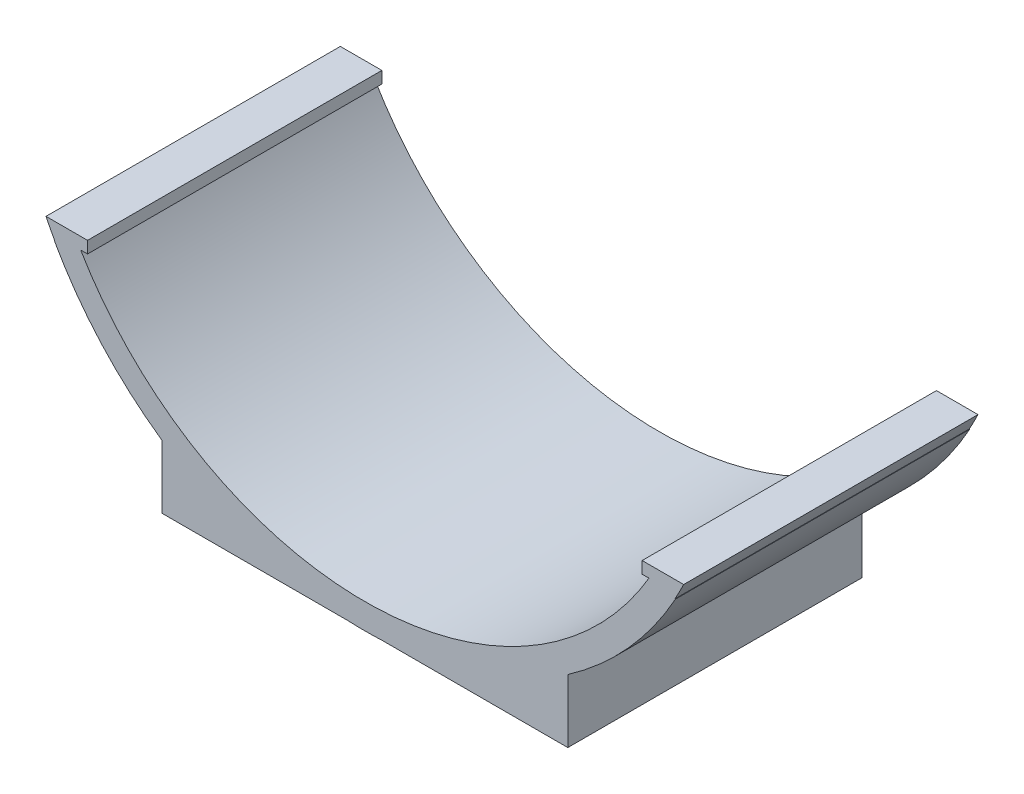
ISO-10303-21;
HEADER;
FILE_DESCRIPTION(('STEP AP214'),'2;1');
FILE_NAME('part.step','',(''),(''),'','','');
FILE_SCHEMA(('AUTOMOTIVE_DESIGN { 1 0 10303 214 1 1 1 1 }'));
ENDSEC;
DATA;
#1=APPLICATION_CONTEXT('core data for automotive mechanical design processes');
#2=APPLICATION_PROTOCOL_DEFINITION('international standard','automotive_design',2000,#1);
#3=PRODUCT_CONTEXT('',#1,'mechanical');
#4=PRODUCT('Part','Part','',(#3));
#5=PRODUCT_RELATED_PRODUCT_CATEGORY('part','',(#4));
#6=PRODUCT_DEFINITION_FORMATION('','',#4);
#7=PRODUCT_DEFINITION_CONTEXT('part definition',#1,'design');
#8=PRODUCT_DEFINITION('design','',#6,#7);
#9=PRODUCT_DEFINITION_SHAPE('','',#8);
#10=(LENGTH_UNIT() NAMED_UNIT(*) SI_UNIT(.MILLI.,.METRE.));
#11=(NAMED_UNIT(*) PLANE_ANGLE_UNIT() SI_UNIT($,.RADIAN.));
#12=(NAMED_UNIT(*) SI_UNIT($,.STERADIAN.) SOLID_ANGLE_UNIT());
#13=UNCERTAINTY_MEASURE_WITH_UNIT(LENGTH_MEASURE(1.E-05),#10,'distance_accuracy_value','');
#14=(GEOMETRIC_REPRESENTATION_CONTEXT(3) GLOBAL_UNCERTAINTY_ASSIGNED_CONTEXT((#13)) GLOBAL_UNIT_ASSIGNED_CONTEXT((#10,
#11,#12)) REPRESENTATION_CONTEXT('',''));
#15=CARTESIAN_POINT('',(0.,0.,0.));
#16=DIRECTION('',(0.,0.,1.));
#17=DIRECTION('',(1.,0.,0.));
#18=AXIS2_PLACEMENT_3D('',#15,#16,#17);
#19=CARTESIAN_POINT('',(0.,0.,174.));
#20=DIRECTION('',(0.,0.,-1.));
#21=DIRECTION('',(-1.,0.,0.));
#22=AXIS2_PLACEMENT_3D('',#19,#20,#21);
#23=CYLINDRICAL_SURFACE('',#22,210.);
#24=CARTESIAN_POINT('',(0.,0.,0.));
#25=DIRECTION('',(0.,0.,1.));
#26=DIRECTION('',(1.,0.,0.));
#27=AXIS2_PLACEMENT_3D('',#24,#25,#26);
#28=CIRCLE('',#27,210.);
#29=CARTESIAN_POINT('',(-10.2439006242742,-209.75,0.));
#30=VERTEX_POINT('',#29);
#31=CARTESIAN_POINT('',(10.2439006242742,-209.75,0.));
#32=VERTEX_POINT('',#31);
#33=EDGE_CURVE('E300',#30,#32,#28,.T.);
#34=ORIENTED_EDGE('',*,*,#33,.T.);
#35=DIRECTION('',(0.,0.,1.));
#36=VECTOR('',#35,1.);
#37=CARTESIAN_POINT('',(10.2439006242742,-209.75,-115.957504903706));
#38=LINE('',#37,#36);
#39=CARTESIAN_POINT('',(10.2439006242742,-209.75,174.));
#40=VERTEX_POINT('',#39);
#41=EDGE_CURVE('E250',#32,#40,#38,.T.);
#42=ORIENTED_EDGE('',*,*,#41,.T.);
#43=CARTESIAN_POINT('',(0.,0.,174.));
#44=DIRECTION('',(0.,0.,1.));
#45=DIRECTION('',(1.,0.,0.));
#46=AXIS2_PLACEMENT_3D('',#43,#44,#45);
#47=CIRCLE('',#46,210.);
#48=CARTESIAN_POINT('',(-10.2439006242742,-209.75,174.));
#49=VERTEX_POINT('',#48);
#50=EDGE_CURVE('E297',#49,#40,#47,.T.);
#51=ORIENTED_EDGE('',*,*,#50,.F.);
#52=DIRECTION('',(0.,0.,1.));
#53=VECTOR('',#52,1.);
#54=CARTESIAN_POINT('',(-10.2439006242742,-209.75,-115.957504903706));
#55=LINE('',#54,#53);
#56=EDGE_CURVE('E277',#30,#49,#55,.T.);
#57=ORIENTED_EDGE('',*,*,#56,.F.);
#58=EDGE_LOOP('',(#34,#42,#51,#57));
#59=FACE_BOUND('',#58,.T.);
#60=ADVANCED_FACE('F43',(#59),#23,.T.);
#61=CARTESIAN_POINT('',(120.,-172.336879396141,174.));
#62=VERTEX_POINT('',#61);
#63=CARTESIAN_POINT('',(183.56470248934,-102.,174.));
#64=VERTEX_POINT('',#63);
#65=EDGE_CURVE('E298',#62,#64,#47,.T.);
#66=ORIENTED_EDGE('',*,*,#65,.F.);
#67=DIRECTION('',(0.,0.,1.));
#68=VECTOR('',#67,1.);
#69=CARTESIAN_POINT('',(120.,-172.336879396141,-115.957504903706));
#70=LINE('',#69,#68);
#71=CARTESIAN_POINT('',(120.,-172.336879396141,0.));
#72=VERTEX_POINT('',#71);
#73=EDGE_CURVE('E258',#72,#62,#70,.T.);
#74=ORIENTED_EDGE('',*,*,#73,.F.);
#75=CARTESIAN_POINT('',(183.56470248934,-102.,0.));
#76=VERTEX_POINT('',#75);
#77=EDGE_CURVE('E294',#72,#76,#28,.T.);
#78=ORIENTED_EDGE('',*,*,#77,.T.);
#79=DIRECTION('',(0.,0.,-1.));
#80=VECTOR('',#79,1.);
#81=CARTESIAN_POINT('',(183.56470248934,-102.,174.));
#82=LINE('',#81,#80);
#83=EDGE_CURVE('E285',#76,#64,#82,.F.);
#84=ORIENTED_EDGE('',*,*,#83,.T.);
#85=EDGE_LOOP('',(#66,#74,#78,#84));
#86=FACE_BOUND('',#85,.T.);
#87=ADVANCED_FACE('F45',(#86),#23,.T.);
#88=DIRECTION('',(0.,0.,1.));
#89=VECTOR('',#88,1.);
#90=CARTESIAN_POINT('',(-120.,-172.336879396141,-115.957504903706));
#91=LINE('',#90,#89);
#92=CARTESIAN_POINT('',(-120.,-172.336879396141,0.));
#93=VERTEX_POINT('',#92);
#94=CARTESIAN_POINT('',(-120.,-172.336879396141,174.));
#95=VERTEX_POINT('',#94);
#96=EDGE_CURVE('E275',#93,#95,#91,.T.);
#97=ORIENTED_EDGE('',*,*,#96,.T.);
#98=CARTESIAN_POINT('',(-183.56470248934,-102.,174.));
#99=VERTEX_POINT('',#98);
#100=EDGE_CURVE('E51',#99,#95,#47,.T.);
#101=ORIENTED_EDGE('',*,*,#100,.F.);
#102=DIRECTION('',(0.,0.,-1.));
#103=VECTOR('',#102,1.);
#104=CARTESIAN_POINT('',(-183.56470248934,-102.,174.));
#105=LINE('',#104,#103);
#106=CARTESIAN_POINT('',(-183.56470248934,-102.,0.));
#107=VERTEX_POINT('',#106);
#108=EDGE_CURVE('E267',#99,#107,#105,.T.);
#109=ORIENTED_EDGE('',*,*,#108,.T.);
#110=EDGE_CURVE('E299',#107,#93,#28,.T.);
#111=ORIENTED_EDGE('',*,*,#110,.T.);
#112=EDGE_LOOP('',(#97,#101,#109,#111));
#113=FACE_BOUND('',#112,.T.);
#114=ADVANCED_FACE('F336',(#113),#23,.T.);
#115=CARTESIAN_POINT('',(0.,0.,174.));
#116=DIRECTION('',(0.,0.,1.));
#117=DIRECTION('',(1.,0.,0.));
#118=AXIS2_PLACEMENT_3D('',#115,#116,#117);
#119=PLANE('',#118);
#120=DIRECTION('',(-1.,0.,0.));
#121=VECTOR('',#120,1.);
#122=CARTESIAN_POINT('',(163.933126534708,-99.,174.));
#123=LINE('',#122,#121);
#124=CARTESIAN_POINT('',(168.,-99.,174.));
#125=VERTEX_POINT('',#124);
#126=CARTESIAN_POINT('',(163.933126534708,-99.,174.));
#127=VERTEX_POINT('',#126);
#128=EDGE_CURVE('E170',#125,#127,#123,.T.);
#129=ORIENTED_EDGE('',*,*,#128,.F.);
#130=CARTESIAN_POINT('',(0.,0.,174.));
#131=DIRECTION('',(0.,0.,-1.));
#132=DIRECTION('',(1.,0.,0.));
#133=AXIS2_PLACEMENT_3D('',#130,#131,#132);
#134=CIRCLE('',#133,195.);
#135=CARTESIAN_POINT('',(-168.,-99.,174.));
#136=VERTEX_POINT('',#135);
#137=EDGE_CURVE('E240',#125,#136,#134,.T.);
#138=ORIENTED_EDGE('',*,*,#137,.T.);
#139=DIRECTION('',(-1.,0.,0.));
#140=VECTOR('',#139,1.);
#141=CARTESIAN_POINT('',(-163.933126534708,-99.,174.));
#142=LINE('',#141,#140);
#143=CARTESIAN_POINT('',(-163.933126534708,-99.,174.));
#144=VERTEX_POINT('',#143);
#145=EDGE_CURVE('E205',#144,#136,#142,.T.);
#146=ORIENTED_EDGE('',*,*,#145,.F.);
#147=DIRECTION('',(0.,-1.,0.));
#148=VECTOR('',#147,1.);
#149=CARTESIAN_POINT('',(-163.933126534708,-92.,174.));
#150=LINE('',#149,#148);
#151=CARTESIAN_POINT('',(-163.933126534708,-92.,174.));
#152=VERTEX_POINT('',#151);
#153=EDGE_CURVE('E210',#152,#144,#150,.T.);
#154=ORIENTED_EDGE('',*,*,#153,.F.);
#155=DIRECTION('',(-1.,0.,0.));
#156=VECTOR('',#155,1.);
#157=CARTESIAN_POINT('',(-188.496850106308,-92.,174.));
#158=LINE('',#157,#156);
#159=CARTESIAN_POINT('',(-188.496850106308,-92.,174.));
#160=VERTEX_POINT('',#159);
#161=EDGE_CURVE('E214',#152,#160,#158,.T.);
#162=ORIENTED_EDGE('',*,*,#161,.T.);
#163=CARTESIAN_POINT('',(0.,0.,174.));
#164=DIRECTION('',(0.,0.,1.));
#165=DIRECTION('',(1.,0.,0.));
#166=AXIS2_PLACEMENT_3D('',#163,#164,#165);
#167=CIRCLE('',#166,209.75);
#168=CARTESIAN_POINT('',(-183.278647146906,-102.,174.));
#169=VERTEX_POINT('',#168);
#170=EDGE_CURVE('E231',#160,#169,#167,.T.);
#171=ORIENTED_EDGE('',*,*,#170,.T.);
#172=DIRECTION('',(1.,0.,0.));
#173=VECTOR('',#172,1.);
#174=CARTESIAN_POINT('',(0.,-102.,174.));
#175=LINE('',#174,#173);
#176=EDGE_CURVE('E58',#99,#169,#175,.T.);
#177=ORIENTED_EDGE('',*,*,#176,.F.);
#178=ORIENTED_EDGE('',*,*,#100,.T.);
#179=DIRECTION('',(0.,1.,0.));
#180=VECTOR('',#179,1.);
#181=CARTESIAN_POINT('',(-120.,0.,174.));
#182=LINE('',#181,#180);
#183=CARTESIAN_POINT('',(-120.,-209.75,174.));
#184=VERTEX_POINT('',#183);
#185=EDGE_CURVE('E263',#184,#95,#182,.T.);
#186=ORIENTED_EDGE('',*,*,#185,.F.);
#187=DIRECTION('',(-1.,0.,0.));
#188=VECTOR('',#187,1.);
#189=CARTESIAN_POINT('',(0.,-209.75,174.));
#190=LINE('',#189,#188);
#191=EDGE_CURVE('E271',#49,#184,#190,.T.);
#192=ORIENTED_EDGE('',*,*,#191,.F.);
#193=ORIENTED_EDGE('',*,*,#50,.T.);
#194=DIRECTION('',(1.,0.,0.));
#195=VECTOR('',#194,1.);
#196=CARTESIAN_POINT('',(0.,-209.75,174.));
#197=LINE('',#196,#195);
#198=CARTESIAN_POINT('',(120.,-209.75,174.));
#199=VERTEX_POINT('',#198);
#200=EDGE_CURVE('E244',#40,#199,#197,.T.);
#201=ORIENTED_EDGE('',*,*,#200,.T.);
#202=DIRECTION('',(0.,1.,0.));
#203=VECTOR('',#202,1.);
#204=CARTESIAN_POINT('',(120.,0.,174.));
#205=LINE('',#204,#203);
#206=EDGE_CURVE('E253',#199,#62,#205,.T.);
#207=ORIENTED_EDGE('',*,*,#206,.T.);
#208=ORIENTED_EDGE('',*,*,#65,.T.);
#209=DIRECTION('',(1.,0.,0.));
#210=VECTOR('',#209,1.);
#211=CARTESIAN_POINT('',(0.,-102.,174.));
#212=LINE('',#211,#210);
#213=CARTESIAN_POINT('',(183.278647146906,-102.,174.));
#214=VERTEX_POINT('',#213);
#215=EDGE_CURVE('E288',#214,#64,#212,.T.);
#216=ORIENTED_EDGE('',*,*,#215,.F.);
#217=CARTESIAN_POINT('',(188.496850106308,-92.0000000000001,174.));
#218=VERTEX_POINT('',#217);
#219=EDGE_CURVE('E230',#214,#218,#167,.T.);
#220=ORIENTED_EDGE('',*,*,#219,.T.);
#221=DIRECTION('',(-1.,0.,0.));
#222=VECTOR('',#221,1.);
#223=CARTESIAN_POINT('',(171.933126534708,-92.,174.));
#224=LINE('',#223,#222);
#225=CARTESIAN_POINT('',(163.933126534708,-92.,174.));
#226=VERTEX_POINT('',#225);
#227=EDGE_CURVE('E173',#218,#226,#224,.T.);
#228=ORIENTED_EDGE('',*,*,#227,.T.);
#229=DIRECTION('',(0.,1.,0.));
#230=VECTOR('',#229,1.);
#231=CARTESIAN_POINT('',(163.933126534708,-92.,174.));
#232=LINE('',#231,#230);
#233=EDGE_CURVE('E166',#127,#226,#232,.T.);
#234=ORIENTED_EDGE('',*,*,#233,.F.);
#235=EDGE_LOOP('',(#129,#138,#146,#154,#162,#171,#177,#178,#186,#192,#193,#201,#207,#208,#216,
#220,#228,#234));
#236=FACE_BOUND('',#235,.T.);
#237=ADVANCED_FACE('F168',(#236),#119,.T.);
#238=CARTESIAN_POINT('',(0.,0.,0.));
#239=DIRECTION('',(0.,0.,1.));
#240=DIRECTION('',(1.,0.,0.));
#241=AXIS2_PLACEMENT_3D('',#238,#239,#240);
#242=PLANE('',#241);
#243=CARTESIAN_POINT('',(0.,0.,0.));
#244=DIRECTION('',(0.,0.,1.));
#245=DIRECTION('',(1.,0.,0.));
#246=AXIS2_PLACEMENT_3D('',#243,#244,#245);
#247=CIRCLE('',#246,195.);
#248=CARTESIAN_POINT('',(-168.,-99.,0.));
#249=VERTEX_POINT('',#248);
#250=CARTESIAN_POINT('',(168.,-99.,0.));
#251=VERTEX_POINT('',#250);
#252=EDGE_CURVE('E241',#249,#251,#247,.T.);
#253=ORIENTED_EDGE('',*,*,#252,.T.);
#254=DIRECTION('',(-1.,0.,0.));
#255=VECTOR('',#254,1.);
#256=CARTESIAN_POINT('',(163.933126534708,-99.,0.));
#257=LINE('',#256,#255);
#258=CARTESIAN_POINT('',(163.933126534708,-99.,0.));
#259=VERTEX_POINT('',#258);
#260=EDGE_CURVE('E192',#251,#259,#257,.T.);
#261=ORIENTED_EDGE('',*,*,#260,.T.);
#262=DIRECTION('',(0.,1.,0.));
#263=VECTOR('',#262,1.);
#264=CARTESIAN_POINT('',(163.933126534708,-92.,0.));
#265=LINE('',#264,#263);
#266=CARTESIAN_POINT('',(163.933126534708,-92.,0.));
#267=VERTEX_POINT('',#266);
#268=EDGE_CURVE('E183',#259,#267,#265,.T.);
#269=ORIENTED_EDGE('',*,*,#268,.T.);
#270=DIRECTION('',(1.,0.,0.));
#271=VECTOR('',#270,1.);
#272=CARTESIAN_POINT('',(171.933126534708,-92.,0.));
#273=LINE('',#272,#271);
#274=CARTESIAN_POINT('',(188.496850106308,-92.0000000000001,0.));
#275=VERTEX_POINT('',#274);
#276=EDGE_CURVE('E225',#267,#275,#273,.T.);
#277=ORIENTED_EDGE('',*,*,#276,.T.);
#278=CARTESIAN_POINT('',(0.,0.,0.));
#279=DIRECTION('',(0.,0.,1.));
#280=DIRECTION('',(1.,0.,0.));
#281=AXIS2_PLACEMENT_3D('',#278,#279,#280);
#282=CIRCLE('',#281,209.75);
#283=CARTESIAN_POINT('',(183.278647146906,-102.,0.));
#284=VERTEX_POINT('',#283);
#285=EDGE_CURVE('E222',#275,#284,#282,.F.);
#286=ORIENTED_EDGE('',*,*,#285,.T.);
#287=DIRECTION('',(-1.,0.,0.));
#288=VECTOR('',#287,1.);
#289=CARTESIAN_POINT('',(0.,-102.,0.));
#290=LINE('',#289,#288);
#291=EDGE_CURVE('E289',#76,#284,#290,.T.);
#292=ORIENTED_EDGE('',*,*,#291,.F.);
#293=ORIENTED_EDGE('',*,*,#77,.F.);
#294=DIRECTION('',(0.,-1.,0.));
#295=VECTOR('',#294,1.);
#296=CARTESIAN_POINT('',(120.,0.,0.));
#297=LINE('',#296,#295);
#298=CARTESIAN_POINT('',(120.,-209.75,0.));
#299=VERTEX_POINT('',#298);
#300=EDGE_CURVE('E249',#72,#299,#297,.T.);
#301=ORIENTED_EDGE('',*,*,#300,.T.);
#302=DIRECTION('',(-1.,0.,0.));
#303=VECTOR('',#302,1.);
#304=CARTESIAN_POINT('',(0.,-209.75,0.));
#305=LINE('',#304,#303);
#306=EDGE_CURVE('E246',#299,#32,#305,.T.);
#307=ORIENTED_EDGE('',*,*,#306,.T.);
#308=ORIENTED_EDGE('',*,*,#33,.F.);
#309=DIRECTION('',(1.,0.,0.));
#310=VECTOR('',#309,1.);
#311=CARTESIAN_POINT('',(0.,-209.75,0.));
#312=LINE('',#311,#310);
#313=CARTESIAN_POINT('',(-120.,-209.75,0.));
#314=VERTEX_POINT('',#313);
#315=EDGE_CURVE('E268',#314,#30,#312,.T.);
#316=ORIENTED_EDGE('',*,*,#315,.F.);
#317=DIRECTION('',(0.,-1.,0.));
#318=VECTOR('',#317,1.);
#319=CARTESIAN_POINT('',(-120.,0.,0.));
#320=LINE('',#319,#318);
#321=EDGE_CURVE('E264',#93,#314,#320,.T.);
#322=ORIENTED_EDGE('',*,*,#321,.F.);
#323=ORIENTED_EDGE('',*,*,#110,.F.);
#324=DIRECTION('',(-1.,0.,0.));
#325=VECTOR('',#324,1.);
#326=CARTESIAN_POINT('',(0.,-102.,0.));
#327=LINE('',#326,#325);
#328=CARTESIAN_POINT('',(-183.278647146906,-102.,0.));
#329=VERTEX_POINT('',#328);
#330=EDGE_CURVE('E292',#329,#107,#327,.T.);
#331=ORIENTED_EDGE('',*,*,#330,.F.);
#332=CARTESIAN_POINT('',(-188.496850106308,-92.,0.));
#333=VERTEX_POINT('',#332);
#334=EDGE_CURVE('E220',#329,#333,#282,.F.);
#335=ORIENTED_EDGE('',*,*,#334,.T.);
#336=DIRECTION('',(1.,0.,0.));
#337=VECTOR('',#336,1.);
#338=CARTESIAN_POINT('',(-188.496850106308,-92.,0.));
#339=LINE('',#338,#337);
#340=CARTESIAN_POINT('',(-163.933126534708,-92.,0.));
#341=VERTEX_POINT('',#340);
#342=EDGE_CURVE('E218',#333,#341,#339,.T.);
#343=ORIENTED_EDGE('',*,*,#342,.T.);
#344=DIRECTION('',(0.,-1.,0.));
#345=VECTOR('',#344,1.);
#346=CARTESIAN_POINT('',(-163.933126534708,-92.,0.));
#347=LINE('',#346,#345);
#348=CARTESIAN_POINT('',(-163.933126534708,-99.,0.));
#349=VERTEX_POINT('',#348);
#350=EDGE_CURVE('E198',#341,#349,#347,.T.);
#351=ORIENTED_EDGE('',*,*,#350,.T.);
#352=DIRECTION('',(-1.,0.,0.));
#353=VECTOR('',#352,1.);
#354=CARTESIAN_POINT('',(-163.933126534708,-99.,0.));
#355=LINE('',#354,#353);
#356=EDGE_CURVE('E199',#349,#249,#355,.T.);
#357=ORIENTED_EDGE('',*,*,#356,.T.);
#358=EDGE_LOOP('',(#253,#261,#269,#277,#286,#292,#293,#301,#307,#308,#316,#322,#323,#331,#335,
#343,#351,#357));
#359=FACE_BOUND('',#358,.T.);
#360=ADVANCED_FACE('F311',(#359),#242,.F.);
#361=CARTESIAN_POINT('',(0.,-102.,-5.64183047049638));
#362=DIRECTION('',(0.,-1.,0.));
#363=DIRECTION('',(0.,0.,-1.));
#364=AXIS2_PLACEMENT_3D('',#361,#362,#363);
#365=PLANE('',#364);
#366=ORIENTED_EDGE('',*,*,#176,.T.);
#367=DIRECTION('',(0.,0.,1.));
#368=VECTOR('',#367,1.);
#369=CARTESIAN_POINT('',(-183.278647146906,-102.,-394.954823365914));
#370=LINE('',#369,#368);
#371=EDGE_CURVE('E227',#169,#329,#370,.F.);
#372=ORIENTED_EDGE('',*,*,#371,.T.);
#373=ORIENTED_EDGE('',*,*,#330,.T.);
#374=ORIENTED_EDGE('',*,*,#108,.F.);
#375=EDGE_LOOP('',(#366,#372,#373,#374));
#376=FACE_BOUND('',#375,.T.);
#377=ADVANCED_FACE('F338',(#376),#365,.F.);
#378=CARTESIAN_POINT('',(0.,-102.,-5.64183047049638));
#379=DIRECTION('',(0.,-1.,0.));
#380=DIRECTION('',(0.,0.,-1.));
#381=AXIS2_PLACEMENT_3D('',#378,#379,#380);
#382=PLANE('',#381);
#383=ORIENTED_EDGE('',*,*,#291,.T.);
#384=DIRECTION('',(0.,0.,1.));
#385=VECTOR('',#384,1.);
#386=CARTESIAN_POINT('',(183.278647146906,-102.,-394.954823365914));
#387=LINE('',#386,#385);
#388=EDGE_CURVE('E12',#284,#214,#387,.T.);
#389=ORIENTED_EDGE('',*,*,#388,.T.);
#390=ORIENTED_EDGE('',*,*,#215,.T.);
#391=ORIENTED_EDGE('',*,*,#83,.F.);
#392=EDGE_LOOP('',(#383,#389,#390,#391));
#393=FACE_BOUND('',#392,.T.);
#394=ADVANCED_FACE('F313',(#393),#382,.F.);
#395=CARTESIAN_POINT('',(0.,-209.75,-115.957504903706));
#396=DIRECTION('',(0.,1.,0.));
#397=DIRECTION('',(-1.,0.,0.));
#398=AXIS2_PLACEMENT_3D('',#395,#396,#397);
#399=PLANE('',#398);
#400=DIRECTION('',(0.,0.,1.));
#401=VECTOR('',#400,1.);
#402=CARTESIAN_POINT('',(-120.,-209.75,-115.957504903706));
#403=LINE('',#402,#401);
#404=EDGE_CURVE('E274',#314,#184,#403,.T.);
#405=ORIENTED_EDGE('',*,*,#404,.F.);
#406=ORIENTED_EDGE('',*,*,#315,.T.);
#407=ORIENTED_EDGE('',*,*,#56,.T.);
#408=ORIENTED_EDGE('',*,*,#191,.T.);
#409=EDGE_LOOP('',(#405,#406,#407,#408));
#410=FACE_BOUND('',#409,.T.);
#411=ADVANCED_FACE('F331',(#410),#399,.F.);
#412=CARTESIAN_POINT('',(-120.,0.,-115.957504903706));
#413=DIRECTION('',(1.,0.,0.));
#414=DIRECTION('',(0.,0.,-1.));
#415=AXIS2_PLACEMENT_3D('',#412,#413,#414);
#416=PLANE('',#415);
#417=ORIENTED_EDGE('',*,*,#96,.F.);
#418=ORIENTED_EDGE('',*,*,#321,.T.);
#419=ORIENTED_EDGE('',*,*,#404,.T.);
#420=ORIENTED_EDGE('',*,*,#185,.T.);
#421=EDGE_LOOP('',(#417,#418,#419,#420));
#422=FACE_BOUND('',#421,.T.);
#423=ADVANCED_FACE('F334',(#422),#416,.F.);
#424=CARTESIAN_POINT('',(0.,-209.75,-115.957504903706));
#425=DIRECTION('',(0.,-1.,0.));
#426=DIRECTION('',(1.,0.,0.));
#427=AXIS2_PLACEMENT_3D('',#424,#425,#426);
#428=PLANE('',#427);
#429=ORIENTED_EDGE('',*,*,#306,.F.);
#430=DIRECTION('',(0.,0.,1.));
#431=VECTOR('',#430,1.);
#432=CARTESIAN_POINT('',(120.,-209.75,-115.957504903706));
#433=LINE('',#432,#431);
#434=EDGE_CURVE('E256',#299,#199,#433,.T.);
#435=ORIENTED_EDGE('',*,*,#434,.T.);
#436=ORIENTED_EDGE('',*,*,#200,.F.);
#437=ORIENTED_EDGE('',*,*,#41,.F.);
#438=EDGE_LOOP('',(#429,#435,#436,#437));
#439=FACE_BOUND('',#438,.T.);
#440=ADVANCED_FACE('F322',(#439),#428,.T.);
#441=CARTESIAN_POINT('',(120.,0.,-115.957504903706));
#442=DIRECTION('',(1.,0.,0.));
#443=DIRECTION('',(0.,0.,-1.));
#444=AXIS2_PLACEMENT_3D('',#441,#442,#443);
#445=PLANE('',#444);
#446=ORIENTED_EDGE('',*,*,#300,.F.);
#447=ORIENTED_EDGE('',*,*,#73,.T.);
#448=ORIENTED_EDGE('',*,*,#206,.F.);
#449=ORIENTED_EDGE('',*,*,#434,.F.);
#450=EDGE_LOOP('',(#446,#447,#448,#449));
#451=FACE_BOUND('',#450,.T.);
#452=ADVANCED_FACE('F317',(#451),#445,.T.);
#453=CARTESIAN_POINT('',(0.,0.,-365.268394471791));
#454=DIRECTION('',(0.,0.,1.));
#455=DIRECTION('',(1.,0.,0.));
#456=AXIS2_PLACEMENT_3D('',#453,#454,#455);
#457=CYLINDRICAL_SURFACE('',#456,195.);
#458=DIRECTION('',(0.,0.,-1.));
#459=VECTOR('',#458,1.);
#460=CARTESIAN_POINT('',(168.,-99.,183.45827557051));
#461=LINE('',#460,#459);
#462=EDGE_CURVE('E189',#125,#251,#461,.T.);
#463=ORIENTED_EDGE('',*,*,#462,.T.);
#464=ORIENTED_EDGE('',*,*,#252,.F.);
#465=DIRECTION('',(0.,0.,-1.));
#466=VECTOR('',#465,1.);
#467=CARTESIAN_POINT('',(-168.,-99.,183.45827557051));
#468=LINE('',#467,#466);
#469=EDGE_CURVE('E208',#136,#249,#468,.T.);
#470=ORIENTED_EDGE('',*,*,#469,.F.);
#471=ORIENTED_EDGE('',*,*,#137,.F.);
#472=EDGE_LOOP('',(#463,#464,#470,#471));
#473=FACE_BOUND('',#472,.T.);
#474=ADVANCED_FACE('F358',(#473),#457,.F.);
#475=CARTESIAN_POINT('',(171.933126534708,-92.,-394.954823365914));
#476=DIRECTION('',(0.,1.,0.));
#477=DIRECTION('',(0.,0.,1.));
#478=AXIS2_PLACEMENT_3D('',#475,#476,#477);
#479=PLANE('',#478);
#480=ORIENTED_EDGE('',*,*,#276,.F.);
#481=DIRECTION('',(0.,0.,-1.));
#482=VECTOR('',#481,1.);
#483=CARTESIAN_POINT('',(163.933126534708,-92.,183.45827557051));
#484=LINE('',#483,#482);
#485=EDGE_CURVE('E177',#226,#267,#484,.T.);
#486=ORIENTED_EDGE('',*,*,#485,.F.);
#487=ORIENTED_EDGE('',*,*,#227,.F.);
#488=DIRECTION('',(0.,0.,1.));
#489=VECTOR('',#488,1.);
#490=CARTESIAN_POINT('',(188.496850106308,-92.0000000000001,-394.954823365914));
#491=LINE('',#490,#489);
#492=EDGE_CURVE('E221',#275,#218,#491,.T.);
#493=ORIENTED_EDGE('',*,*,#492,.F.);
#494=EDGE_LOOP('',(#480,#486,#487,#493));
#495=FACE_BOUND('',#494,.T.);
#496=ADVANCED_FACE('F363',(#495),#479,.T.);
#497=CARTESIAN_POINT('',(0.,0.,-394.954823365914));
#498=DIRECTION('',(0.,0.,1.));
#499=DIRECTION('',(1.,0.,0.));
#500=AXIS2_PLACEMENT_3D('',#497,#498,#499);
#501=CYLINDRICAL_SURFACE('',#500,209.75);
#502=ORIENTED_EDGE('',*,*,#388,.F.);
#503=ORIENTED_EDGE('',*,*,#285,.F.);
#504=ORIENTED_EDGE('',*,*,#492,.T.);
#505=ORIENTED_EDGE('',*,*,#219,.F.);
#506=EDGE_LOOP('',(#502,#503,#504,#505));
#507=FACE_BOUND('',#506,.T.);
#508=ADVANCED_FACE('F362',(#507),#501,.T.);
#509=ORIENTED_EDGE('',*,*,#371,.F.);
#510=ORIENTED_EDGE('',*,*,#170,.F.);
#511=DIRECTION('',(0.,0.,1.));
#512=VECTOR('',#511,1.);
#513=CARTESIAN_POINT('',(-188.496850106308,-92.,-394.954823365914));
#514=LINE('',#513,#512);
#515=EDGE_CURVE('E235',#333,#160,#514,.T.);
#516=ORIENTED_EDGE('',*,*,#515,.F.);
#517=ORIENTED_EDGE('',*,*,#334,.F.);
#518=EDGE_LOOP('',(#509,#510,#516,#517));
#519=FACE_BOUND('',#518,.T.);
#520=ADVANCED_FACE('F343',(#519),#501,.T.);
#521=CARTESIAN_POINT('',(-188.496850106308,-92.,-394.954823365914));
#522=DIRECTION('',(0.,1.,0.));
#523=DIRECTION('',(0.,0.,1.));
#524=AXIS2_PLACEMENT_3D('',#521,#522,#523);
#525=PLANE('',#524);
#526=ORIENTED_EDGE('',*,*,#342,.F.);
#527=ORIENTED_EDGE('',*,*,#515,.T.);
#528=ORIENTED_EDGE('',*,*,#161,.F.);
#529=DIRECTION('',(0.,0.,-1.));
#530=VECTOR('',#529,1.);
#531=CARTESIAN_POINT('',(-163.933126534708,-92.,183.45827557051));
#532=LINE('',#531,#530);
#533=EDGE_CURVE('E202',#152,#341,#532,.T.);
#534=ORIENTED_EDGE('',*,*,#533,.T.);
#535=EDGE_LOOP('',(#526,#527,#528,#534));
#536=FACE_BOUND('',#535,.T.);
#537=ADVANCED_FACE('F345',(#536),#525,.T.);
#538=CARTESIAN_POINT('',(-163.933126534708,-92.,183.45827557051));
#539=DIRECTION('',(1.,0.,0.));
#540=DIRECTION('',(0.,0.,-1.));
#541=AXIS2_PLACEMENT_3D('',#538,#539,#540);
#542=PLANE('',#541);
#543=ORIENTED_EDGE('',*,*,#533,.F.);
#544=ORIENTED_EDGE('',*,*,#153,.T.);
#545=DIRECTION('',(0.,0.,-1.));
#546=VECTOR('',#545,1.);
#547=CARTESIAN_POINT('',(-163.933126534708,-99.,183.45827557051));
#548=LINE('',#547,#546);
#549=EDGE_CURVE('E209',#144,#349,#548,.T.);
#550=ORIENTED_EDGE('',*,*,#549,.T.);
#551=ORIENTED_EDGE('',*,*,#350,.F.);
#552=EDGE_LOOP('',(#543,#544,#550,#551));
#553=FACE_BOUND('',#552,.T.);
#554=ADVANCED_FACE('F352',(#553),#542,.T.);
#555=CARTESIAN_POINT('',(-163.933126534708,-99.,183.45827557051));
#556=DIRECTION('',(0.,-1.,0.));
#557=DIRECTION('',(1.,0.,0.));
#558=AXIS2_PLACEMENT_3D('',#555,#556,#557);
#559=PLANE('',#558);
#560=ORIENTED_EDGE('',*,*,#549,.F.);
#561=ORIENTED_EDGE('',*,*,#145,.T.);
#562=ORIENTED_EDGE('',*,*,#469,.T.);
#563=ORIENTED_EDGE('',*,*,#356,.F.);
#564=EDGE_LOOP('',(#560,#561,#562,#563));
#565=FACE_BOUND('',#564,.T.);
#566=ADVANCED_FACE('F355',(#565),#559,.T.);
#567=CARTESIAN_POINT('',(163.933126534708,-99.,183.45827557051));
#568=DIRECTION('',(0.,-1.,0.));
#569=DIRECTION('',(1.,0.,0.));
#570=AXIS2_PLACEMENT_3D('',#567,#568,#569);
#571=PLANE('',#570);
#572=ORIENTED_EDGE('',*,*,#462,.F.);
#573=ORIENTED_EDGE('',*,*,#128,.T.);
#574=DIRECTION('',(0.,0.,-1.));
#575=VECTOR('',#574,1.);
#576=CARTESIAN_POINT('',(163.933126534708,-99.,183.45827557051));
#577=LINE('',#576,#575);
#578=EDGE_CURVE('E178',#127,#259,#577,.T.);
#579=ORIENTED_EDGE('',*,*,#578,.T.);
#580=ORIENTED_EDGE('',*,*,#260,.F.);
#581=EDGE_LOOP('',(#572,#573,#579,#580));
#582=FACE_BOUND('',#581,.T.);
#583=ADVANCED_FACE('F187',(#582),#571,.T.);
#584=CARTESIAN_POINT('',(163.933126534708,-92.,183.45827557051));
#585=DIRECTION('',(-1.,0.,0.));
#586=DIRECTION('',(0.,0.,1.));
#587=AXIS2_PLACEMENT_3D('',#584,#585,#586);
#588=PLANE('',#587);
#589=ORIENTED_EDGE('',*,*,#578,.F.);
#590=ORIENTED_EDGE('',*,*,#233,.T.);
#591=ORIENTED_EDGE('',*,*,#485,.T.);
#592=ORIENTED_EDGE('',*,*,#268,.F.);
#593=EDGE_LOOP('',(#589,#590,#591,#592));
#594=FACE_BOUND('',#593,.T.);
#595=ADVANCED_FACE('F181',(#594),#588,.T.);
#596=CLOSED_SHELL('',(#60,#87,#114,#237,#360,#377,#394,#411,#423,#440,#452,#474,#496,#508,#520,
#537,#554,#566,#583,#595));
#597=MANIFOLD_SOLID_BREP('B2',#596);
#598=ADVANCED_BREP_SHAPE_REPRESENTATION('',(#18,#597),#14);
#599=SHAPE_DEFINITION_REPRESENTATION(#9,#598);
ENDSEC;
END-ISO-10303-21;
